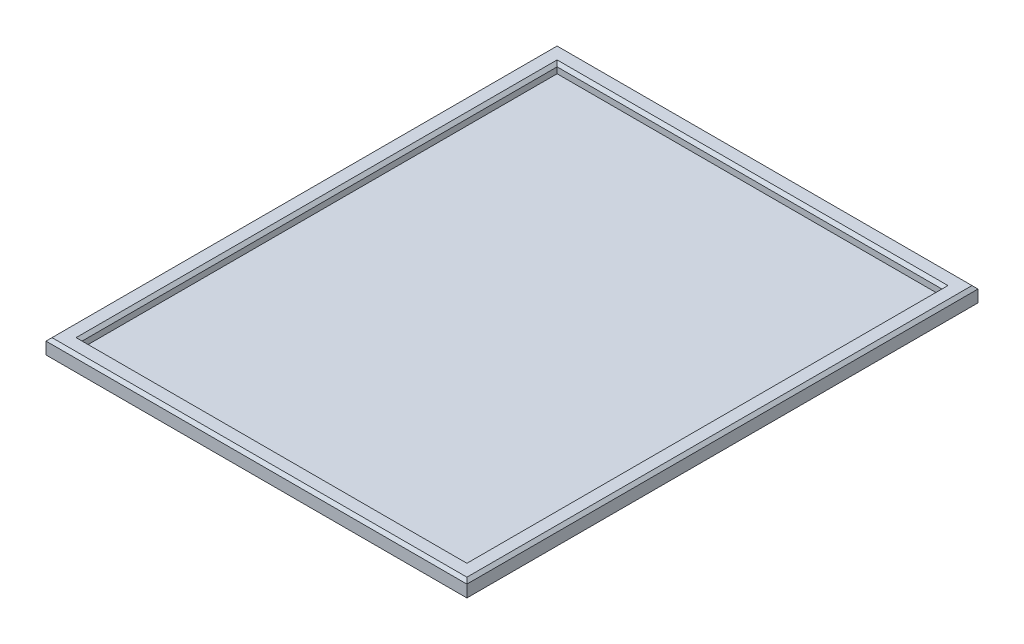
ISO-10303-21;
HEADER;
FILE_DESCRIPTION(('STEP AP214'),'2;1');
FILE_NAME('part.step','',(''),(''),'','','');
FILE_SCHEMA(('AUTOMOTIVE_DESIGN { 1 0 10303 214 1 1 1 1 }'));
ENDSEC;
DATA;
#1=APPLICATION_CONTEXT('core data for automotive mechanical design processes');
#2=APPLICATION_PROTOCOL_DEFINITION('international standard','automotive_design',2000,#1);
#3=PRODUCT_CONTEXT('',#1,'mechanical');
#4=PRODUCT('Part','Part','',(#3));
#5=PRODUCT_RELATED_PRODUCT_CATEGORY('part','',(#4));
#6=PRODUCT_DEFINITION_FORMATION('','',#4);
#7=PRODUCT_DEFINITION_CONTEXT('part definition',#1,'design');
#8=PRODUCT_DEFINITION('design','',#6,#7);
#9=PRODUCT_DEFINITION_SHAPE('','',#8);
#10=(LENGTH_UNIT() NAMED_UNIT(*) SI_UNIT(.MILLI.,.METRE.));
#11=(NAMED_UNIT(*) PLANE_ANGLE_UNIT() SI_UNIT($,.RADIAN.));
#12=(NAMED_UNIT(*) SI_UNIT($,.STERADIAN.) SOLID_ANGLE_UNIT());
#13=UNCERTAINTY_MEASURE_WITH_UNIT(LENGTH_MEASURE(1.E-05),#10,'distance_accuracy_value','');
#14=(GEOMETRIC_REPRESENTATION_CONTEXT(3) GLOBAL_UNCERTAINTY_ASSIGNED_CONTEXT((#13)) GLOBAL_UNIT_ASSIGNED_CONTEXT((#10,
#11,#12)) REPRESENTATION_CONTEXT('',''));
#15=CARTESIAN_POINT('',(0.,0.,0.));
#16=DIRECTION('',(0.,0.,1.));
#17=DIRECTION('',(1.,0.,0.));
#18=AXIS2_PLACEMENT_3D('',#15,#16,#17);
#19=CARTESIAN_POINT('',(-320.,15.,395.));
#20=DIRECTION('',(0.,0.,1.));
#21=DIRECTION('',(1.,0.,0.));
#22=AXIS2_PLACEMENT_3D('',#19,#20,#21);
#23=PLANE('',#22);
#24=DIRECTION('',(-1.,0.,0.));
#25=VECTOR('',#24,1.);
#26=CARTESIAN_POINT('',(-320.,0.,395.));
#27=LINE('',#26,#25);
#28=CARTESIAN_POINT('',(320.,0.,395.));
#29=VERTEX_POINT('',#28);
#30=CARTESIAN_POINT('',(-320.,0.,395.));
#31=VERTEX_POINT('',#30);
#32=EDGE_CURVE('E113',#29,#31,#27,.T.);
#33=ORIENTED_EDGE('',*,*,#32,.F.);
#34=DIRECTION('',(0.,-1.,0.));
#35=VECTOR('',#34,1.);
#36=CARTESIAN_POINT('',(320.,15.,395.));
#37=LINE('',#36,#35);
#38=CARTESIAN_POINT('',(320.,15.,395.));
#39=VERTEX_POINT('',#38);
#40=EDGE_CURVE('E12',#39,#29,#37,.T.);
#41=ORIENTED_EDGE('',*,*,#40,.F.);
#42=DIRECTION('',(-1.,0.,0.));
#43=VECTOR('',#42,1.);
#44=CARTESIAN_POINT('',(-320.,15.,395.));
#45=LINE('',#44,#43);
#46=CARTESIAN_POINT('',(-320.,15.,395.));
#47=VERTEX_POINT('',#46);
#48=EDGE_CURVE('E107',#39,#47,#45,.T.);
#49=ORIENTED_EDGE('',*,*,#48,.T.);
#50=DIRECTION('',(0.,-1.,0.));
#51=VECTOR('',#50,1.);
#52=CARTESIAN_POINT('',(-320.,15.,395.));
#53=LINE('',#52,#51);
#54=EDGE_CURVE('E52',#47,#31,#53,.T.);
#55=ORIENTED_EDGE('',*,*,#54,.T.);
#56=EDGE_LOOP('',(#33,#41,#49,#55));
#57=FACE_BOUND('',#56,.T.);
#58=ADVANCED_FACE('F49',(#57),#23,.T.);
#59=CARTESIAN_POINT('',(320.,15.,395.));
#60=DIRECTION('',(1.,0.,0.));
#61=DIRECTION('',(0.,0.,-1.));
#62=AXIS2_PLACEMENT_3D('',#59,#60,#61);
#63=PLANE('',#62);
#64=DIRECTION('',(0.,0.,1.));
#65=VECTOR('',#64,1.);
#66=CARTESIAN_POINT('',(320.,0.,395.));
#67=LINE('',#66,#65);
#68=CARTESIAN_POINT('',(320.,0.,-395.));
#69=VERTEX_POINT('',#68);
#70=EDGE_CURVE('E109',#69,#29,#67,.T.);
#71=ORIENTED_EDGE('',*,*,#70,.F.);
#72=DIRECTION('',(0.,-1.,0.));
#73=VECTOR('',#72,1.);
#74=CARTESIAN_POINT('',(320.,15.,-395.));
#75=LINE('',#74,#73);
#76=CARTESIAN_POINT('',(320.,15.,-395.));
#77=VERTEX_POINT('',#76);
#78=EDGE_CURVE('E58',#77,#69,#75,.T.);
#79=ORIENTED_EDGE('',*,*,#78,.F.);
#80=DIRECTION('',(0.,0.,1.));
#81=VECTOR('',#80,1.);
#82=CARTESIAN_POINT('',(320.,15.,395.));
#83=LINE('',#82,#81);
#84=EDGE_CURVE('E104',#77,#39,#83,.T.);
#85=ORIENTED_EDGE('',*,*,#84,.T.);
#86=ORIENTED_EDGE('',*,*,#40,.T.);
#87=EDGE_LOOP('',(#71,#79,#85,#86));
#88=FACE_BOUND('',#87,.T.);
#89=ADVANCED_FACE('F123',(#88),#63,.T.);
#90=CARTESIAN_POINT('',(320.,15.,-395.));
#91=DIRECTION('',(0.,0.,-1.));
#92=DIRECTION('',(-1.,0.,0.));
#93=AXIS2_PLACEMENT_3D('',#90,#91,#92);
#94=PLANE('',#93);
#95=DIRECTION('',(1.,0.,0.));
#96=VECTOR('',#95,1.);
#97=CARTESIAN_POINT('',(320.,0.,-395.));
#98=LINE('',#97,#96);
#99=CARTESIAN_POINT('',(-320.,0.,-395.));
#100=VERTEX_POINT('',#99);
#101=EDGE_CURVE('E99',#100,#69,#98,.T.);
#102=ORIENTED_EDGE('',*,*,#101,.F.);
#103=DIRECTION('',(0.,-1.,0.));
#104=VECTOR('',#103,1.);
#105=CARTESIAN_POINT('',(-320.,15.,-395.));
#106=LINE('',#105,#104);
#107=CARTESIAN_POINT('',(-320.,15.,-395.));
#108=VERTEX_POINT('',#107);
#109=EDGE_CURVE('E94',#108,#100,#106,.T.);
#110=ORIENTED_EDGE('',*,*,#109,.F.);
#111=DIRECTION('',(1.,0.,0.));
#112=VECTOR('',#111,1.);
#113=CARTESIAN_POINT('',(320.,15.,-395.));
#114=LINE('',#113,#112);
#115=EDGE_CURVE('E97',#108,#77,#114,.T.);
#116=ORIENTED_EDGE('',*,*,#115,.T.);
#117=ORIENTED_EDGE('',*,*,#78,.T.);
#118=EDGE_LOOP('',(#102,#110,#116,#117));
#119=FACE_BOUND('',#118,.T.);
#120=ADVANCED_FACE('F96',(#119),#94,.T.);
#121=CARTESIAN_POINT('',(-320.,15.,-395.));
#122=DIRECTION('',(-1.,0.,0.));
#123=DIRECTION('',(0.,0.,1.));
#124=AXIS2_PLACEMENT_3D('',#121,#122,#123);
#125=PLANE('',#124);
#126=DIRECTION('',(0.,0.,-1.));
#127=VECTOR('',#126,1.);
#128=CARTESIAN_POINT('',(-320.,0.,-395.));
#129=LINE('',#128,#127);
#130=EDGE_CURVE('E116',#31,#100,#129,.T.);
#131=ORIENTED_EDGE('',*,*,#130,.F.);
#132=ORIENTED_EDGE('',*,*,#54,.F.);
#133=DIRECTION('',(0.,0.,-1.));
#134=VECTOR('',#133,1.);
#135=CARTESIAN_POINT('',(-320.,15.,-395.));
#136=LINE('',#135,#134);
#137=EDGE_CURVE('E103',#47,#108,#136,.T.);
#138=ORIENTED_EDGE('',*,*,#137,.T.);
#139=ORIENTED_EDGE('',*,*,#109,.T.);
#140=EDGE_LOOP('',(#131,#132,#138,#139));
#141=FACE_BOUND('',#140,.T.);
#142=ADVANCED_FACE('F106',(#141),#125,.T.);
#143=CARTESIAN_POINT('',(0.,15.,0.));
#144=DIRECTION('',(0.,1.,0.));
#145=DIRECTION('',(0.,0.,1.));
#146=AXIS2_PLACEMENT_3D('',#143,#144,#145);
#147=PLANE('',#146);
#148=ORIENTED_EDGE('',*,*,#48,.F.);
#149=ORIENTED_EDGE('',*,*,#84,.F.);
#150=ORIENTED_EDGE('',*,*,#115,.F.);
#151=ORIENTED_EDGE('',*,*,#137,.F.);
#152=EDGE_LOOP('',(#148,#149,#150,#151));
#153=FACE_BOUND('',#152,.T.);
#154=ADVANCED_FACE('F102',(#153),#147,.T.);
#155=CARTESIAN_POINT('',(0.,0.,0.));
#156=DIRECTION('',(0.,1.,0.));
#157=DIRECTION('',(0.,0.,1.));
#158=AXIS2_PLACEMENT_3D('',#155,#156,#157);
#159=PLANE('',#158);
#160=ORIENTED_EDGE('',*,*,#32,.T.);
#161=ORIENTED_EDGE('',*,*,#130,.T.);
#162=ORIENTED_EDGE('',*,*,#101,.T.);
#163=ORIENTED_EDGE('',*,*,#70,.T.);
#164=EDGE_LOOP('',(#160,#161,#162,#163));
#165=FACE_BOUND('',#164,.T.);
#166=ADVANCED_FACE('F122',(#165),#159,.F.);
#167=CLOSED_SHELL('',(#58,#89,#120,#142,#154,#166));
#168=MANIFOLD_SOLID_BREP('B2',#167);
#169=CARTESIAN_POINT('',(0.,30.,0.));
#170=DIRECTION('',(0.,-1.,0.));
#171=DIRECTION('',(0.,0.,-1.));
#172=AXIS2_PLACEMENT_3D('',#169,#170,#171);
#173=PLANE('',#172);
#174=DIRECTION('',(0.,0.,1.));
#175=VECTOR('',#174,1.);
#176=CARTESIAN_POINT('',(325.,30.,395.));
#177=LINE('',#176,#175);
#178=CARTESIAN_POINT('',(325.,30.,-400.));
#179=VERTEX_POINT('',#178);
#180=CARTESIAN_POINT('',(325.,30.,400.));
#181=VERTEX_POINT('',#180);
#182=EDGE_CURVE('E341',#179,#181,#177,.T.);
#183=ORIENTED_EDGE('',*,*,#182,.T.);
#184=DIRECTION('',(-1.,0.,0.));
#185=VECTOR('',#184,1.);
#186=CARTESIAN_POINT('',(-320.,30.,400.));
#187=LINE('',#186,#185);
#188=CARTESIAN_POINT('',(-325.,30.,400.));
#189=VERTEX_POINT('',#188);
#190=EDGE_CURVE('E343',#181,#189,#187,.T.);
#191=ORIENTED_EDGE('',*,*,#190,.T.);
#192=DIRECTION('',(0.,0.,-1.));
#193=VECTOR('',#192,1.);
#194=CARTESIAN_POINT('',(-325.,30.,-395.));
#195=LINE('',#194,#193);
#196=CARTESIAN_POINT('',(-325.,30.,-400.));
#197=VERTEX_POINT('',#196);
#198=EDGE_CURVE('E337',#189,#197,#195,.T.);
#199=ORIENTED_EDGE('',*,*,#198,.T.);
#200=DIRECTION('',(1.,0.,0.));
#201=VECTOR('',#200,1.);
#202=CARTESIAN_POINT('',(320.,30.,-400.));
#203=LINE('',#202,#201);
#204=EDGE_CURVE('E339',#197,#179,#203,.T.);
#205=ORIENTED_EDGE('',*,*,#204,.T.);
#206=EDGE_LOOP('',(#183,#191,#199,#205));
#207=FACE_BOUND('',#206,.T.);
#208=DIRECTION('',(0.,0.,1.));
#209=VECTOR('',#208,1.);
#210=CARTESIAN_POINT('',(-345.,30.,0.));
#211=LINE('',#210,#209);
#212=CARTESIAN_POINT('',(-345.,30.,-420.));
#213=VERTEX_POINT('',#212);
#214=CARTESIAN_POINT('',(-345.,30.,420.));
#215=VERTEX_POINT('',#214);
#216=EDGE_CURVE('E332',#213,#215,#211,.T.);
#217=ORIENTED_EDGE('',*,*,#216,.T.);
#218=DIRECTION('',(1.,0.,0.));
#219=VECTOR('',#218,1.);
#220=CARTESIAN_POINT('',(0.,30.,420.));
#221=LINE('',#220,#219);
#222=CARTESIAN_POINT('',(345.,30.,420.));
#223=VERTEX_POINT('',#222);
#224=EDGE_CURVE('E334',#215,#223,#221,.T.);
#225=ORIENTED_EDGE('',*,*,#224,.T.);
#226=DIRECTION('',(0.,0.,-1.));
#227=VECTOR('',#226,1.);
#228=CARTESIAN_POINT('',(345.,30.,0.));
#229=LINE('',#228,#227);
#230=CARTESIAN_POINT('',(345.,30.,-420.));
#231=VERTEX_POINT('',#230);
#232=EDGE_CURVE('E328',#223,#231,#229,.T.);
#233=ORIENTED_EDGE('',*,*,#232,.T.);
#234=DIRECTION('',(-1.,0.,0.));
#235=VECTOR('',#234,1.);
#236=CARTESIAN_POINT('',(0.,30.,-420.));
#237=LINE('',#236,#235);
#238=EDGE_CURVE('E330',#231,#213,#237,.T.);
#239=ORIENTED_EDGE('',*,*,#238,.T.);
#240=EDGE_LOOP('',(#217,#225,#233,#239));
#241=FACE_BOUND('',#240,.T.);
#242=ADVANCED_FACE('F173',(#207,#241),#173,.F.);
#243=CARTESIAN_POINT('',(0.,0.,0.));
#244=DIRECTION('',(0.,-1.,0.));
#245=DIRECTION('',(0.,0.,-1.));
#246=AXIS2_PLACEMENT_3D('',#243,#244,#245);
#247=PLANE('',#246);
#248=DIRECTION('',(1.,0.,0.));
#249=VECTOR('',#248,1.);
#250=CARTESIAN_POINT('',(350.,0.,-420.));
#251=LINE('',#250,#249);
#252=CARTESIAN_POINT('',(-345.,0.,-420.));
#253=VERTEX_POINT('',#252);
#254=CARTESIAN_POINT('',(345.,0.,-420.));
#255=VERTEX_POINT('',#254);
#256=EDGE_CURVE('E183',#253,#255,#251,.T.);
#257=ORIENTED_EDGE('',*,*,#256,.T.);
#258=DIRECTION('',(0.,0.,1.));
#259=VECTOR('',#258,1.);
#260=CARTESIAN_POINT('',(345.,0.,425.));
#261=LINE('',#260,#259);
#262=CARTESIAN_POINT('',(345.,0.,420.));
#263=VERTEX_POINT('',#262);
#264=EDGE_CURVE('E47',#255,#263,#261,.T.);
#265=ORIENTED_EDGE('',*,*,#264,.T.);
#266=DIRECTION('',(-1.,0.,0.));
#267=VECTOR('',#266,1.);
#268=CARTESIAN_POINT('',(-350.,0.,420.));
#269=LINE('',#268,#267);
#270=CARTESIAN_POINT('',(-345.,0.,420.));
#271=VERTEX_POINT('',#270);
#272=EDGE_CURVE('E369',#263,#271,#269,.T.);
#273=ORIENTED_EDGE('',*,*,#272,.T.);
#274=DIRECTION('',(0.,0.,-1.));
#275=VECTOR('',#274,1.);
#276=CARTESIAN_POINT('',(-345.,0.,-425.));
#277=LINE('',#276,#275);
#278=EDGE_CURVE('E194',#271,#253,#277,.T.);
#279=ORIENTED_EDGE('',*,*,#278,.T.);
#280=EDGE_LOOP('',(#257,#265,#273,#279));
#281=FACE_BOUND('',#280,.T.);
#282=DIRECTION('',(-1.,0.,0.));
#283=VECTOR('',#282,1.);
#284=CARTESIAN_POINT('',(-320.,0.,-395.));
#285=LINE('',#284,#283);
#286=CARTESIAN_POINT('',(320.,0.,-395.));
#287=VERTEX_POINT('',#286);
#288=CARTESIAN_POINT('',(-320.,0.,-395.));
#289=VERTEX_POINT('',#288);
#290=EDGE_CURVE('E301',#287,#289,#285,.T.);
#291=ORIENTED_EDGE('',*,*,#290,.T.);
#292=DIRECTION('',(0.,0.,1.));
#293=VECTOR('',#292,1.);
#294=CARTESIAN_POINT('',(-320.,0.,395.));
#295=LINE('',#294,#293);
#296=CARTESIAN_POINT('',(-320.,0.,395.));
#297=VERTEX_POINT('',#296);
#298=EDGE_CURVE('E280',#289,#297,#295,.T.);
#299=ORIENTED_EDGE('',*,*,#298,.T.);
#300=DIRECTION('',(1.,0.,0.));
#301=VECTOR('',#300,1.);
#302=CARTESIAN_POINT('',(-320.,0.,395.));
#303=LINE('',#302,#301);
#304=CARTESIAN_POINT('',(320.,0.,395.));
#305=VERTEX_POINT('',#304);
#306=EDGE_CURVE('E291',#297,#305,#303,.T.);
#307=ORIENTED_EDGE('',*,*,#306,.T.);
#308=DIRECTION('',(0.,0.,-1.));
#309=VECTOR('',#308,1.);
#310=CARTESIAN_POINT('',(320.,0.,395.));
#311=LINE('',#310,#309);
#312=EDGE_CURVE('E297',#305,#287,#311,.T.);
#313=ORIENTED_EDGE('',*,*,#312,.T.);
#314=EDGE_LOOP('',(#291,#299,#307,#313));
#315=FACE_BOUND('',#314,.T.);
#316=ADVANCED_FACE('F299',(#281,#315),#247,.T.);
#317=CARTESIAN_POINT('',(350.,30.,425.));
#318=DIRECTION('',(-1.,0.,0.));
#319=DIRECTION('',(0.,0.,1.));
#320=AXIS2_PLACEMENT_3D('',#317,#318,#319);
#321=PLANE('',#320);
#322=DIRECTION('',(0.,-1.,0.));
#323=VECTOR('',#322,1.);
#324=CARTESIAN_POINT('',(350.,30.,-425.));
#325=LINE('',#324,#323);
#326=CARTESIAN_POINT('',(350.,24.9999999999998,-425.));
#327=VERTEX_POINT('',#326);
#328=CARTESIAN_POINT('',(350.,5.,-425.));
#329=VERTEX_POINT('',#328);
#330=EDGE_CURVE('E323',#327,#329,#325,.T.);
#331=ORIENTED_EDGE('',*,*,#330,.F.);
#332=DIRECTION('',(0.,0.,1.));
#333=VECTOR('',#332,1.);
#334=CARTESIAN_POINT('',(350.,24.9999999999998,425.));
#335=LINE('',#334,#333);
#336=CARTESIAN_POINT('',(350.,24.9999999999998,425.));
#337=VERTEX_POINT('',#336);
#338=EDGE_CURVE('E367',#327,#337,#335,.T.);
#339=ORIENTED_EDGE('',*,*,#338,.T.);
#340=DIRECTION('',(0.,-1.,0.));
#341=VECTOR('',#340,1.);
#342=CARTESIAN_POINT('',(350.,30.,425.));
#343=LINE('',#342,#341);
#344=CARTESIAN_POINT('',(350.,5.,425.));
#345=VERTEX_POINT('',#344);
#346=EDGE_CURVE('E287',#337,#345,#343,.T.);
#347=ORIENTED_EDGE('',*,*,#346,.T.);
#348=DIRECTION('',(0.,0.,-1.));
#349=VECTOR('',#348,1.);
#350=CARTESIAN_POINT('',(350.,5.,-425.));
#351=LINE('',#350,#349);
#352=EDGE_CURVE('E364',#345,#329,#351,.T.);
#353=ORIENTED_EDGE('',*,*,#352,.T.);
#354=EDGE_LOOP('',(#331,#339,#347,#353));
#355=FACE_BOUND('',#354,.T.);
#356=ADVANCED_FACE('F411',(#355),#321,.F.);
#357=CARTESIAN_POINT('',(-350.,30.,-425.));
#358=DIRECTION('',(0.,0.,1.));
#359=DIRECTION('',(1.,0.,0.));
#360=AXIS2_PLACEMENT_3D('',#357,#358,#359);
#361=PLANE('',#360);
#362=DIRECTION('',(0.,-1.,0.));
#363=VECTOR('',#362,1.);
#364=CARTESIAN_POINT('',(-350.,30.,-425.));
#365=LINE('',#364,#363);
#366=CARTESIAN_POINT('',(-350.,24.9999999999998,-425.));
#367=VERTEX_POINT('',#366);
#368=CARTESIAN_POINT('',(-350.,5.,-425.));
#369=VERTEX_POINT('',#368);
#370=EDGE_CURVE('E320',#367,#369,#365,.T.);
#371=ORIENTED_EDGE('',*,*,#370,.F.);
#372=DIRECTION('',(1.,0.,0.));
#373=VECTOR('',#372,1.);
#374=CARTESIAN_POINT('',(-350.,24.9999999999998,-425.));
#375=LINE('',#374,#373);
#376=EDGE_CURVE('E362',#367,#327,#375,.T.);
#377=ORIENTED_EDGE('',*,*,#376,.T.);
#378=ORIENTED_EDGE('',*,*,#330,.T.);
#379=DIRECTION('',(-1.,0.,0.));
#380=VECTOR('',#379,1.);
#381=CARTESIAN_POINT('',(-350.,5.,-425.));
#382=LINE('',#381,#380);
#383=EDGE_CURVE('E360',#329,#369,#382,.T.);
#384=ORIENTED_EDGE('',*,*,#383,.T.);
#385=EDGE_LOOP('',(#371,#377,#378,#384));
#386=FACE_BOUND('',#385,.T.);
#387=ADVANCED_FACE('F417',(#386),#361,.F.);
#388=CARTESIAN_POINT('',(-350.,30.,425.));
#389=DIRECTION('',(1.,0.,0.));
#390=DIRECTION('',(0.,0.,-1.));
#391=AXIS2_PLACEMENT_3D('',#388,#389,#390);
#392=PLANE('',#391);
#393=DIRECTION('',(0.,-1.,0.));
#394=VECTOR('',#393,1.);
#395=CARTESIAN_POINT('',(-350.,30.,425.));
#396=LINE('',#395,#394);
#397=CARTESIAN_POINT('',(-350.,24.9999999999998,425.));
#398=VERTEX_POINT('',#397);
#399=CARTESIAN_POINT('',(-350.,5.,425.));
#400=VERTEX_POINT('',#399);
#401=EDGE_CURVE('E317',#398,#400,#396,.T.);
#402=ORIENTED_EDGE('',*,*,#401,.F.);
#403=DIRECTION('',(0.,0.,-1.));
#404=VECTOR('',#403,1.);
#405=CARTESIAN_POINT('',(-350.,24.9999999999998,425.));
#406=LINE('',#405,#404);
#407=EDGE_CURVE('E358',#398,#367,#406,.T.);
#408=ORIENTED_EDGE('',*,*,#407,.T.);
#409=ORIENTED_EDGE('',*,*,#370,.T.);
#410=DIRECTION('',(0.,0.,1.));
#411=VECTOR('',#410,1.);
#412=CARTESIAN_POINT('',(-350.,5.,425.));
#413=LINE('',#412,#411);
#414=EDGE_CURVE('E356',#369,#400,#413,.T.);
#415=ORIENTED_EDGE('',*,*,#414,.T.);
#416=EDGE_LOOP('',(#402,#408,#409,#415));
#417=FACE_BOUND('',#416,.T.);
#418=ADVANCED_FACE('F427',(#417),#392,.F.);
#419=CARTESIAN_POINT('',(-350.,30.,425.));
#420=DIRECTION('',(0.,0.,-1.));
#421=DIRECTION('',(-1.,0.,0.));
#422=AXIS2_PLACEMENT_3D('',#419,#420,#421);
#423=PLANE('',#422);
#424=ORIENTED_EDGE('',*,*,#346,.F.);
#425=DIRECTION('',(-1.,0.,0.));
#426=VECTOR('',#425,1.);
#427=CARTESIAN_POINT('',(-350.,24.9999999999998,425.));
#428=LINE('',#427,#426);
#429=EDGE_CURVE('E353',#337,#398,#428,.T.);
#430=ORIENTED_EDGE('',*,*,#429,.T.);
#431=ORIENTED_EDGE('',*,*,#401,.T.);
#432=DIRECTION('',(1.,0.,0.));
#433=VECTOR('',#432,1.);
#434=CARTESIAN_POINT('',(350.,5.,425.));
#435=LINE('',#434,#433);
#436=EDGE_CURVE('E351',#400,#345,#435,.T.);
#437=ORIENTED_EDGE('',*,*,#436,.T.);
#438=EDGE_LOOP('',(#424,#430,#431,#437));
#439=FACE_BOUND('',#438,.T.);
#440=ADVANCED_FACE('F424',(#439),#423,.F.);
#441=CARTESIAN_POINT('',(-320.,30.,395.));
#442=DIRECTION('',(1.,0.,0.));
#443=DIRECTION('',(0.,0.,-1.));
#444=AXIS2_PLACEMENT_3D('',#441,#442,#443);
#445=PLANE('',#444);
#446=DIRECTION('',(0.,-1.,0.));
#447=VECTOR('',#446,1.);
#448=CARTESIAN_POINT('',(-320.,30.,-395.));
#449=LINE('',#448,#447);
#450=CARTESIAN_POINT('',(-320.,25.0000000000002,-395.));
#451=VERTEX_POINT('',#450);
#452=EDGE_CURVE('E310',#451,#289,#449,.T.);
#453=ORIENTED_EDGE('',*,*,#452,.F.);
#454=DIRECTION('',(0.,0.,1.));
#455=VECTOR('',#454,1.);
#456=CARTESIAN_POINT('',(-320.,25.0000000000002,395.));
#457=LINE('',#456,#455);
#458=CARTESIAN_POINT('',(-320.,25.0000000000002,395.));
#459=VERTEX_POINT('',#458);
#460=EDGE_CURVE('E283',#451,#459,#457,.T.);
#461=ORIENTED_EDGE('',*,*,#460,.T.);
#462=DIRECTION('',(0.,-1.,0.));
#463=VECTOR('',#462,1.);
#464=CARTESIAN_POINT('',(-320.,30.,395.));
#465=LINE('',#464,#463);
#466=EDGE_CURVE('E275',#459,#297,#465,.T.);
#467=ORIENTED_EDGE('',*,*,#466,.T.);
#468=ORIENTED_EDGE('',*,*,#298,.F.);
#469=EDGE_LOOP('',(#453,#461,#467,#468));
#470=FACE_BOUND('',#469,.T.);
#471=ADVANCED_FACE('F278',(#470),#445,.T.);
#472=CARTESIAN_POINT('',(-320.,30.,395.));
#473=DIRECTION('',(0.,0.,-1.));
#474=DIRECTION('',(-1.,0.,0.));
#475=AXIS2_PLACEMENT_3D('',#472,#473,#474);
#476=PLANE('',#475);
#477=ORIENTED_EDGE('',*,*,#466,.F.);
#478=DIRECTION('',(1.,0.,0.));
#479=VECTOR('',#478,1.);
#480=CARTESIAN_POINT('',(320.,25.0000000000002,395.));
#481=LINE('',#480,#479);
#482=CARTESIAN_POINT('',(320.,25.0000000000002,395.));
#483=VERTEX_POINT('',#482);
#484=EDGE_CURVE('E326',#459,#483,#481,.T.);
#485=ORIENTED_EDGE('',*,*,#484,.T.);
#486=DIRECTION('',(0.,-1.,0.));
#487=VECTOR('',#486,1.);
#488=CARTESIAN_POINT('',(320.,30.,395.));
#489=LINE('',#488,#487);
#490=EDGE_CURVE('E288',#483,#305,#489,.T.);
#491=ORIENTED_EDGE('',*,*,#490,.T.);
#492=ORIENTED_EDGE('',*,*,#306,.F.);
#493=EDGE_LOOP('',(#477,#485,#491,#492));
#494=FACE_BOUND('',#493,.T.);
#495=ADVANCED_FACE('F292',(#494),#476,.T.);
#496=CARTESIAN_POINT('',(320.,30.,395.));
#497=DIRECTION('',(-1.,0.,0.));
#498=DIRECTION('',(0.,0.,1.));
#499=AXIS2_PLACEMENT_3D('',#496,#497,#498);
#500=PLANE('',#499);
#501=ORIENTED_EDGE('',*,*,#490,.F.);
#502=DIRECTION('',(0.,0.,-1.));
#503=VECTOR('',#502,1.);
#504=CARTESIAN_POINT('',(320.,25.0000000000002,-395.));
#505=LINE('',#504,#503);
#506=CARTESIAN_POINT('',(320.,25.0000000000002,-395.));
#507=VERTEX_POINT('',#506);
#508=EDGE_CURVE('E346',#483,#507,#505,.T.);
#509=ORIENTED_EDGE('',*,*,#508,.T.);
#510=DIRECTION('',(0.,-1.,0.));
#511=VECTOR('',#510,1.);
#512=CARTESIAN_POINT('',(320.,30.,-395.));
#513=LINE('',#512,#511);
#514=EDGE_CURVE('E312',#507,#287,#513,.T.);
#515=ORIENTED_EDGE('',*,*,#514,.T.);
#516=ORIENTED_EDGE('',*,*,#312,.F.);
#517=EDGE_LOOP('',(#501,#509,#515,#516));
#518=FACE_BOUND('',#517,.T.);
#519=ADVANCED_FACE('F548',(#518),#500,.T.);
#520=CARTESIAN_POINT('',(-320.,30.,-395.));
#521=DIRECTION('',(0.,0.,1.));
#522=DIRECTION('',(1.,0.,0.));
#523=AXIS2_PLACEMENT_3D('',#520,#521,#522);
#524=PLANE('',#523);
#525=ORIENTED_EDGE('',*,*,#514,.F.);
#526=DIRECTION('',(-1.,0.,0.));
#527=VECTOR('',#526,1.);
#528=CARTESIAN_POINT('',(-320.,25.0000000000002,-395.));
#529=LINE('',#528,#527);
#530=EDGE_CURVE('E348',#507,#451,#529,.T.);
#531=ORIENTED_EDGE('',*,*,#530,.T.);
#532=ORIENTED_EDGE('',*,*,#452,.T.);
#533=ORIENTED_EDGE('',*,*,#290,.F.);
#534=EDGE_LOOP('',(#525,#531,#532,#533));
#535=FACE_BOUND('',#534,.T.);
#536=ADVANCED_FACE('F464',(#535),#524,.T.);
#537=CARTESIAN_POINT('',(-320.,25.0000000000002,-395.));
#538=DIRECTION('',(0.,0.707106781186553,0.707106781186542));
#539=DIRECTION('',(1.,0.,0.));
#540=AXIS2_PLACEMENT_3D('',#537,#538,#539);
#541=PLANE('',#540);
#542=DIRECTION('',(0.577350269189625,0.577350269189621,-0.577350269189631));
#543=VECTOR('',#542,1.);
#544=CARTESIAN_POINT('',(56.6666666666647,-238.333333333334,-131.666666666662));
#545=LINE('',#544,#543);
#546=EDGE_CURVE('E305',#179,#507,#545,.F.);
#547=ORIENTED_EDGE('',*,*,#546,.F.);
#548=ORIENTED_EDGE('',*,*,#204,.F.);
#549=DIRECTION('',(-0.577350269189631,0.577350269189618,-0.577350269189628));
#550=VECTOR('',#549,1.);
#551=CARTESIAN_POINT('',(-320.,25.0000000000002,-395.));
#552=LINE('',#551,#550);
#553=EDGE_CURVE('E302',#451,#197,#552,.T.);
#554=ORIENTED_EDGE('',*,*,#553,.F.);
#555=ORIENTED_EDGE('',*,*,#530,.F.);
#556=EDGE_LOOP('',(#547,#548,#554,#555));
#557=FACE_BOUND('',#556,.T.);
#558=ADVANCED_FACE('F458',(#557),#541,.T.);
#559=CARTESIAN_POINT('',(-320.,25.0000000000002,395.));
#560=DIRECTION('',(0.70710678118654,0.707106781186555,0.));
#561=DIRECTION('',(0.,0.,-1.));
#562=AXIS2_PLACEMENT_3D('',#559,#560,#561);
#563=PLANE('',#562);
#564=ORIENTED_EDGE('',*,*,#553,.T.);
#565=ORIENTED_EDGE('',*,*,#198,.F.);
#566=DIRECTION('',(0.57735026918963,-0.577350269189617,-0.57735026918963));
#567=VECTOR('',#566,1.);
#568=CARTESIAN_POINT('',(-320.,25.0000000000002,395.));
#569=LINE('',#568,#567);
#570=EDGE_CURVE('E375',#459,#189,#569,.F.);
#571=ORIENTED_EDGE('',*,*,#570,.F.);
#572=ORIENTED_EDGE('',*,*,#460,.F.);
#573=EDGE_LOOP('',(#564,#565,#571,#572));
#574=FACE_BOUND('',#573,.T.);
#575=ADVANCED_FACE('F451',(#574),#563,.T.);
#576=CARTESIAN_POINT('',(320.,25.0000000000002,395.));
#577=DIRECTION('',(-0.707106781186545,0.707106781186549,0.));
#578=DIRECTION('',(0.,0.,1.));
#579=AXIS2_PLACEMENT_3D('',#576,#577,#578);
#580=PLANE('',#579);
#581=ORIENTED_EDGE('',*,*,#546,.T.);
#582=ORIENTED_EDGE('',*,*,#508,.F.);
#583=DIRECTION('',(0.577350269189624,0.57735026918962,0.577350269189633));
#584=VECTOR('',#583,1.);
#585=CARTESIAN_POINT('',(106.666666666668,-188.33333333333,181.666666666665));
#586=LINE('',#585,#584);
#587=EDGE_CURVE('E373',#181,#483,#586,.F.);
#588=ORIENTED_EDGE('',*,*,#587,.F.);
#589=ORIENTED_EDGE('',*,*,#182,.F.);
#590=EDGE_LOOP('',(#581,#582,#588,#589));
#591=FACE_BOUND('',#590,.T.);
#592=ADVANCED_FACE('F444',(#591),#580,.T.);
#593=CARTESIAN_POINT('',(-320.,25.0000000000002,395.));
#594=DIRECTION('',(0.,0.707106781186555,-0.70710678118654));
#595=DIRECTION('',(-1.,0.,0.));
#596=AXIS2_PLACEMENT_3D('',#593,#594,#595);
#597=PLANE('',#596);
#598=ORIENTED_EDGE('',*,*,#570,.T.);
#599=ORIENTED_EDGE('',*,*,#190,.F.);
#600=ORIENTED_EDGE('',*,*,#587,.T.);
#601=ORIENTED_EDGE('',*,*,#484,.F.);
#602=EDGE_LOOP('',(#598,#599,#600,#601));
#603=FACE_BOUND('',#602,.T.);
#604=ADVANCED_FACE('F436',(#603),#597,.T.);
#605=CARTESIAN_POINT('',(0.,30.,-420.));
#606=DIRECTION('',(0.,-0.707106781186548,0.707106781186548));
#607=DIRECTION('',(-1.,0.,0.));
#608=AXIS2_PLACEMENT_3D('',#605,#606,#607);
#609=PLANE('',#608);
#610=DIRECTION('',(-0.577350269189626,0.577350269189626,0.577350269189626));
#611=VECTOR('',#610,1.);
#612=CARTESIAN_POINT('',(205.,170.,-280.));
#613=LINE('',#612,#611);
#614=EDGE_CURVE('E384',#327,#231,#613,.T.);
#615=ORIENTED_EDGE('',*,*,#614,.F.);
#616=ORIENTED_EDGE('',*,*,#376,.F.);
#617=DIRECTION('',(0.577350269189626,0.577350269189626,0.577350269189626));
#618=VECTOR('',#617,1.);
#619=CARTESIAN_POINT('',(-230.,145.,-305.));
#620=LINE('',#619,#618);
#621=EDGE_CURVE('E376',#213,#367,#620,.F.);
#622=ORIENTED_EDGE('',*,*,#621,.F.);
#623=ORIENTED_EDGE('',*,*,#238,.F.);
#624=EDGE_LOOP('',(#615,#616,#622,#623));
#625=FACE_BOUND('',#624,.T.);
#626=ADVANCED_FACE('F443',(#625),#609,.F.);
#627=CARTESIAN_POINT('',(-345.,30.,0.));
#628=DIRECTION('',(0.707106781186548,-0.707106781186548,0.));
#629=DIRECTION('',(0.,0.,1.));
#630=AXIS2_PLACEMENT_3D('',#627,#628,#629);
#631=PLANE('',#630);
#632=ORIENTED_EDGE('',*,*,#621,.T.);
#633=ORIENTED_EDGE('',*,*,#407,.F.);
#634=DIRECTION('',(0.577350269189626,0.577350269189626,-0.577350269189626));
#635=VECTOR('',#634,1.);
#636=CARTESIAN_POINT('',(-205.,170.,280.));
#637=LINE('',#636,#635);
#638=EDGE_CURVE('E382',#215,#398,#637,.F.);
#639=ORIENTED_EDGE('',*,*,#638,.F.);
#640=ORIENTED_EDGE('',*,*,#216,.F.);
#641=EDGE_LOOP('',(#632,#633,#639,#640));
#642=FACE_BOUND('',#641,.T.);
#643=ADVANCED_FACE('F480',(#642),#631,.F.);
#644=CARTESIAN_POINT('',(345.,30.,0.));
#645=DIRECTION('',(-0.707106781186548,-0.707106781186548,0.));
#646=DIRECTION('',(0.,0.,-1.));
#647=AXIS2_PLACEMENT_3D('',#644,#645,#646);
#648=PLANE('',#647);
#649=ORIENTED_EDGE('',*,*,#614,.T.);
#650=ORIENTED_EDGE('',*,*,#232,.F.);
#651=DIRECTION('',(0.577350269189626,-0.577350269189626,0.577350269189626));
#652=VECTOR('',#651,1.);
#653=CARTESIAN_POINT('',(205.,170.,280.));
#654=LINE('',#653,#652);
#655=EDGE_CURVE('E380',#337,#223,#654,.F.);
#656=ORIENTED_EDGE('',*,*,#655,.F.);
#657=ORIENTED_EDGE('',*,*,#338,.F.);
#658=EDGE_LOOP('',(#649,#650,#656,#657));
#659=FACE_BOUND('',#658,.T.);
#660=ADVANCED_FACE('F473',(#659),#648,.F.);
#661=CARTESIAN_POINT('',(0.,30.,420.));
#662=DIRECTION('',(0.,-0.707106781186548,-0.707106781186548));
#663=DIRECTION('',(1.,0.,0.));
#664=AXIS2_PLACEMENT_3D('',#661,#662,#663);
#665=PLANE('',#664);
#666=ORIENTED_EDGE('',*,*,#638,.T.);
#667=ORIENTED_EDGE('',*,*,#429,.F.);
#668=ORIENTED_EDGE('',*,*,#655,.T.);
#669=ORIENTED_EDGE('',*,*,#224,.F.);
#670=EDGE_LOOP('',(#666,#667,#668,#669));
#671=FACE_BOUND('',#670,.T.);
#672=ADVANCED_FACE('F467',(#671),#665,.F.);
#673=CARTESIAN_POINT('',(-350.,5.,425.));
#674=DIRECTION('',(-0.707106781186547,-0.707106781186547,0.));
#675=DIRECTION('',(0.,0.,-1.));
#676=AXIS2_PLACEMENT_3D('',#673,#674,#675);
#677=PLANE('',#676);
#678=DIRECTION('',(0.577350269189626,-0.577350269189626,0.577350269189626));
#679=VECTOR('',#678,1.);
#680=CARTESIAN_POINT('',(-66.6666666666665,-278.333333333333,-141.666666666667));
#681=LINE('',#680,#679);
#682=EDGE_CURVE('E392',#253,#369,#681,.F.);
#683=ORIENTED_EDGE('',*,*,#682,.F.);
#684=ORIENTED_EDGE('',*,*,#278,.F.);
#685=DIRECTION('',(0.577350269189626,-0.577350269189626,-0.577350269189626));
#686=VECTOR('',#685,1.);
#687=CARTESIAN_POINT('',(-350.,5.,425.));
#688=LINE('',#687,#686);
#689=EDGE_CURVE('E178',#400,#271,#688,.T.);
#690=ORIENTED_EDGE('',*,*,#689,.F.);
#691=ORIENTED_EDGE('',*,*,#414,.F.);
#692=EDGE_LOOP('',(#683,#684,#690,#691));
#693=FACE_BOUND('',#692,.T.);
#694=ADVANCED_FACE('F176',(#693),#677,.T.);
#695=CARTESIAN_POINT('',(-350.,5.,425.));
#696=DIRECTION('',(0.,-0.707106781186547,0.707106781186547));
#697=DIRECTION('',(-1.,0.,0.));
#698=AXIS2_PLACEMENT_3D('',#695,#696,#697);
#699=PLANE('',#698);
#700=ORIENTED_EDGE('',*,*,#689,.T.);
#701=ORIENTED_EDGE('',*,*,#272,.F.);
#702=DIRECTION('',(0.577350269189626,0.577350269189626,0.577350269189626));
#703=VECTOR('',#702,1.);
#704=CARTESIAN_POINT('',(116.666666666667,-228.333333333333,191.666666666667));
#705=LINE('',#704,#703);
#706=EDGE_CURVE('E391',#345,#263,#705,.F.);
#707=ORIENTED_EDGE('',*,*,#706,.F.);
#708=ORIENTED_EDGE('',*,*,#436,.F.);
#709=EDGE_LOOP('',(#700,#701,#707,#708));
#710=FACE_BOUND('',#709,.T.);
#711=ADVANCED_FACE('F401',(#710),#699,.T.);
#712=CARTESIAN_POINT('',(-350.,5.,-425.));
#713=DIRECTION('',(0.,-0.707106781186547,-0.707106781186547));
#714=DIRECTION('',(1.,0.,0.));
#715=AXIS2_PLACEMENT_3D('',#712,#713,#714);
#716=PLANE('',#715);
#717=ORIENTED_EDGE('',*,*,#682,.T.);
#718=ORIENTED_EDGE('',*,*,#383,.F.);
#719=DIRECTION('',(-0.577350269189626,-0.577350269189626,0.577350269189626));
#720=VECTOR('',#719,1.);
#721=CARTESIAN_POINT('',(116.666666666667,-228.333333333333,-191.666666666667));
#722=LINE('',#721,#720);
#723=EDGE_CURVE('E389',#255,#329,#722,.F.);
#724=ORIENTED_EDGE('',*,*,#723,.F.);
#725=ORIENTED_EDGE('',*,*,#256,.F.);
#726=EDGE_LOOP('',(#717,#718,#724,#725));
#727=FACE_BOUND('',#726,.T.);
#728=ADVANCED_FACE('F406',(#727),#716,.T.);
#729=CARTESIAN_POINT('',(350.,5.,425.));
#730=DIRECTION('',(0.707106781186547,-0.707106781186547,0.));
#731=DIRECTION('',(0.,0.,1.));
#732=AXIS2_PLACEMENT_3D('',#729,#730,#731);
#733=PLANE('',#732);
#734=ORIENTED_EDGE('',*,*,#706,.T.);
#735=ORIENTED_EDGE('',*,*,#264,.F.);
#736=ORIENTED_EDGE('',*,*,#723,.T.);
#737=ORIENTED_EDGE('',*,*,#352,.F.);
#738=EDGE_LOOP('',(#734,#735,#736,#737));
#739=FACE_BOUND('',#738,.T.);
#740=ADVANCED_FACE('F409',(#739),#733,.T.);
#741=CLOSED_SHELL('',(#242,#316,#356,#387,#418,#440,#471,#495,#519,#536,#558,#575,#592,#604,
#626,#643,#660,#672,#694,#711,#728,#740));
#742=MANIFOLD_SOLID_BREP('B6',#741);
#743=ADVANCED_BREP_SHAPE_REPRESENTATION('',(#18,#168,#742),#14);
#744=SHAPE_DEFINITION_REPRESENTATION(#9,#743);
ENDSEC;
END-ISO-10303-21;
